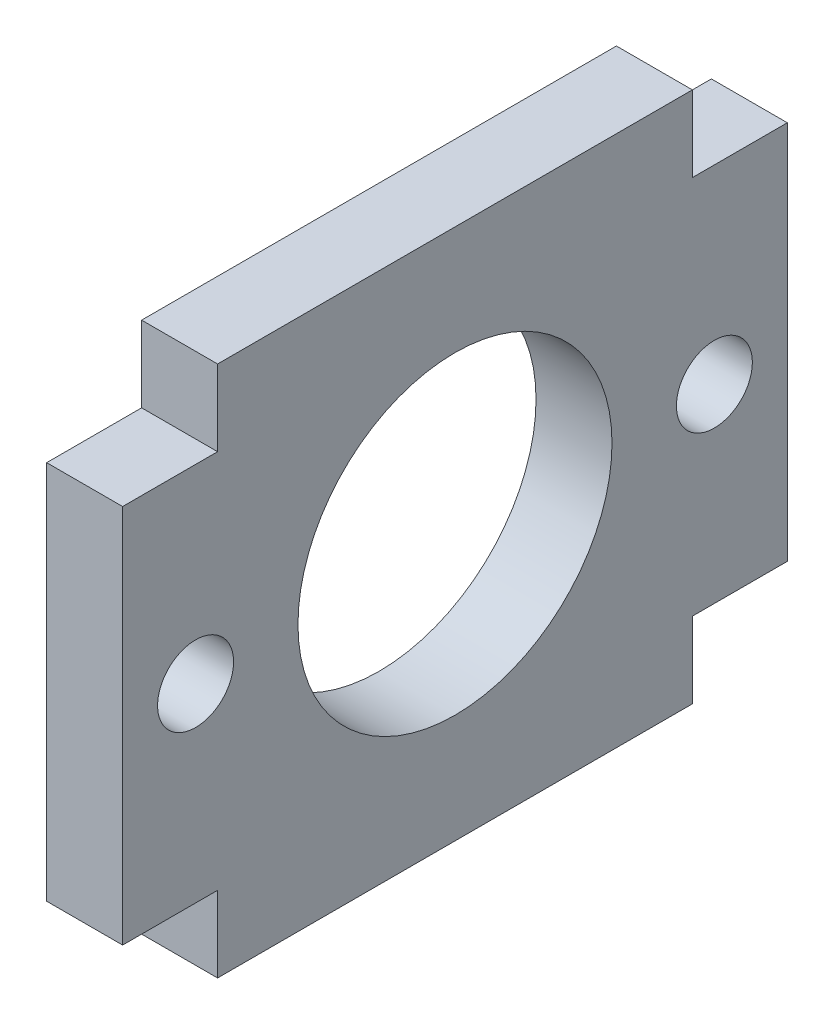
ISO-10303-21;
HEADER;
FILE_DESCRIPTION(('STEP AP214'),'2;1');
FILE_NAME('part.step','',(''),(''),'','','');
FILE_SCHEMA(('AUTOMOTIVE_DESIGN { 1 0 10303 214 1 1 1 1 }'));
ENDSEC;
DATA;
#1=APPLICATION_CONTEXT('core data for automotive mechanical design processes');
#2=APPLICATION_PROTOCOL_DEFINITION('international standard','automotive_design',2000,#1);
#3=PRODUCT_CONTEXT('',#1,'mechanical');
#4=PRODUCT('Part','Part','',(#3));
#5=PRODUCT_RELATED_PRODUCT_CATEGORY('part','',(#4));
#6=PRODUCT_DEFINITION_FORMATION('','',#4);
#7=PRODUCT_DEFINITION_CONTEXT('part definition',#1,'design');
#8=PRODUCT_DEFINITION('design','',#6,#7);
#9=PRODUCT_DEFINITION_SHAPE('','',#8);
#10=(LENGTH_UNIT() NAMED_UNIT(*) SI_UNIT(.MILLI.,.METRE.));
#11=(NAMED_UNIT(*) PLANE_ANGLE_UNIT() SI_UNIT($,.RADIAN.));
#12=(NAMED_UNIT(*) SI_UNIT($,.STERADIAN.) SOLID_ANGLE_UNIT());
#13=UNCERTAINTY_MEASURE_WITH_UNIT(LENGTH_MEASURE(1.E-05),#10,'distance_accuracy_value','');
#14=(GEOMETRIC_REPRESENTATION_CONTEXT(3) GLOBAL_UNCERTAINTY_ASSIGNED_CONTEXT((#13)) GLOBAL_UNIT_ASSIGNED_CONTEXT((#10,
#11,#12)) REPRESENTATION_CONTEXT('',''));
#15=CARTESIAN_POINT('',(0.,0.,0.));
#16=DIRECTION('',(0.,0.,1.));
#17=DIRECTION('',(1.,0.,0.));
#18=AXIS2_PLACEMENT_3D('',#15,#16,#17);
#19=CARTESIAN_POINT('',(5.08,0.,-15.875));
#20=DIRECTION('',(0.,0.,-1.));
#21=DIRECTION('',(0.,1.,0.));
#22=AXIS2_PLACEMENT_3D('',#19,#20,#21);
#23=PLANE('',#22);
#24=DIRECTION('',(0.,-1.,0.));
#25=VECTOR('',#24,1.);
#26=CARTESIAN_POINT('',(0.,0.,-15.875));
#27=LINE('',#26,#25);
#28=CARTESIAN_POINT('',(0.,-12.6999999999999,-15.875));
#29=VERTEX_POINT('',#28);
#30=CARTESIAN_POINT('',(0.,-17.7799999999999,-15.875));
#31=VERTEX_POINT('',#30);
#32=EDGE_CURVE('E162',#29,#31,#27,.T.);
#33=ORIENTED_EDGE('',*,*,#32,.F.);
#34=DIRECTION('',(-1.,0.,0.));
#35=VECTOR('',#34,1.);
#36=CARTESIAN_POINT('',(5.08,-12.6999999999999,-15.875));
#37=LINE('',#36,#35);
#38=CARTESIAN_POINT('',(5.08,-12.6999999999999,-15.875));
#39=VERTEX_POINT('',#38);
#40=EDGE_CURVE('E11',#39,#29,#37,.T.);
#41=ORIENTED_EDGE('',*,*,#40,.F.);
#42=DIRECTION('',(0.,-1.,0.));
#43=VECTOR('',#42,1.);
#44=CARTESIAN_POINT('',(5.08,0.,-15.875));
#45=LINE('',#44,#43);
#46=CARTESIAN_POINT('',(5.08,-17.7799999999999,-15.875));
#47=VERTEX_POINT('',#46);
#48=EDGE_CURVE('E201',#39,#47,#45,.T.);
#49=ORIENTED_EDGE('',*,*,#48,.T.);
#50=DIRECTION('',(-1.,0.,0.));
#51=VECTOR('',#50,1.);
#52=CARTESIAN_POINT('',(5.08,-17.7799999999999,-15.875));
#53=LINE('',#52,#51);
#54=EDGE_CURVE('E98',#47,#31,#53,.T.);
#55=ORIENTED_EDGE('',*,*,#54,.T.);
#56=EDGE_LOOP('',(#33,#41,#49,#55));
#57=FACE_BOUND('',#56,.T.);
#58=ADVANCED_FACE('F35',(#57),#23,.T.);
#59=CARTESIAN_POINT('',(5.08,-12.6999999999998,1.11022302462514E-13));
#60=DIRECTION('',(0.,1.,0.));
#61=DIRECTION('',(0.,0.,1.));
#62=AXIS2_PLACEMENT_3D('',#59,#60,#61);
#63=PLANE('',#62);
#64=DIRECTION('',(0.,0.,-1.));
#65=VECTOR('',#64,1.);
#66=CARTESIAN_POINT('',(0.,-12.6999999999998,1.11022302462514E-13));
#67=LINE('',#66,#65);
#68=CARTESIAN_POINT('',(0.,-12.7,-22.225));
#69=VERTEX_POINT('',#68);
#70=EDGE_CURVE('E165',#29,#69,#67,.T.);
#71=ORIENTED_EDGE('',*,*,#70,.T.);
#72=DIRECTION('',(-1.,0.,0.));
#73=VECTOR('',#72,1.);
#74=CARTESIAN_POINT('',(5.08,-12.7,-22.225));
#75=LINE('',#74,#73);
#76=CARTESIAN_POINT('',(5.08,-12.7,-22.225));
#77=VERTEX_POINT('',#76);
#78=EDGE_CURVE('E43',#77,#69,#75,.T.);
#79=ORIENTED_EDGE('',*,*,#78,.F.);
#80=DIRECTION('',(0.,0.,-1.));
#81=VECTOR('',#80,1.);
#82=CARTESIAN_POINT('',(5.08,-12.6999999999998,1.11022302462514E-13));
#83=LINE('',#82,#81);
#84=EDGE_CURVE('E241',#39,#77,#83,.T.);
#85=ORIENTED_EDGE('',*,*,#84,.F.);
#86=ORIENTED_EDGE('',*,*,#40,.T.);
#87=EDGE_LOOP('',(#71,#79,#85,#86));
#88=FACE_BOUND('',#87,.T.);
#89=ADVANCED_FACE('F260',(#88),#63,.F.);
#90=CARTESIAN_POINT('',(5.08,0.,-22.225));
#91=DIRECTION('',(0.,0.,1.));
#92=DIRECTION('',(1.,0.,0.));
#93=AXIS2_PLACEMENT_3D('',#90,#91,#92);
#94=PLANE('',#93);
#95=DIRECTION('',(0.,1.,0.));
#96=VECTOR('',#95,1.);
#97=CARTESIAN_POINT('',(0.,0.,-22.225));
#98=LINE('',#97,#96);
#99=CARTESIAN_POINT('',(0.,12.7,-22.225));
#100=VERTEX_POINT('',#99);
#101=EDGE_CURVE('E167',#69,#100,#98,.T.);
#102=ORIENTED_EDGE('',*,*,#101,.T.);
#103=DIRECTION('',(-1.,0.,0.));
#104=VECTOR('',#103,1.);
#105=CARTESIAN_POINT('',(5.08,12.7,-22.225));
#106=LINE('',#105,#104);
#107=CARTESIAN_POINT('',(5.08,12.7,-22.225));
#108=VERTEX_POINT('',#107);
#109=EDGE_CURVE('E215',#108,#100,#106,.T.);
#110=ORIENTED_EDGE('',*,*,#109,.F.);
#111=DIRECTION('',(0.,1.,0.));
#112=VECTOR('',#111,1.);
#113=CARTESIAN_POINT('',(5.08,0.,-22.225));
#114=LINE('',#113,#112);
#115=EDGE_CURVE('E223',#77,#108,#114,.T.);
#116=ORIENTED_EDGE('',*,*,#115,.F.);
#117=ORIENTED_EDGE('',*,*,#78,.T.);
#118=EDGE_LOOP('',(#102,#110,#116,#117));
#119=FACE_BOUND('',#118,.T.);
#120=ADVANCED_FACE('F221',(#119),#94,.F.);
#121=CARTESIAN_POINT('',(5.08,12.7,0.));
#122=DIRECTION('',(0.,1.,0.));
#123=DIRECTION('',(0.,0.,1.));
#124=AXIS2_PLACEMENT_3D('',#121,#122,#123);
#125=PLANE('',#124);
#126=DIRECTION('',(0.,0.,-1.));
#127=VECTOR('',#126,1.);
#128=CARTESIAN_POINT('',(0.,12.7,0.));
#129=LINE('',#128,#127);
#130=CARTESIAN_POINT('',(0.,12.7,-15.875));
#131=VERTEX_POINT('',#130);
#132=EDGE_CURVE('E170',#131,#100,#129,.T.);
#133=ORIENTED_EDGE('',*,*,#132,.F.);
#134=DIRECTION('',(-1.,0.,0.));
#135=VECTOR('',#134,1.);
#136=CARTESIAN_POINT('',(5.08,12.7,-15.875));
#137=LINE('',#136,#135);
#138=CARTESIAN_POINT('',(5.08,12.7,-15.875));
#139=VERTEX_POINT('',#138);
#140=EDGE_CURVE('E213',#139,#131,#137,.T.);
#141=ORIENTED_EDGE('',*,*,#140,.F.);
#142=DIRECTION('',(0.,0.,-1.));
#143=VECTOR('',#142,1.);
#144=CARTESIAN_POINT('',(5.08,12.7,0.));
#145=LINE('',#144,#143);
#146=EDGE_CURVE('E236',#139,#108,#145,.T.);
#147=ORIENTED_EDGE('',*,*,#146,.T.);
#148=ORIENTED_EDGE('',*,*,#109,.T.);
#149=EDGE_LOOP('',(#133,#141,#147,#148));
#150=FACE_BOUND('',#149,.T.);
#151=ADVANCED_FACE('F232',(#150),#125,.T.);
#152=CARTESIAN_POINT('',(5.08,0.,-15.875));
#153=DIRECTION('',(0.,0.,1.));
#154=DIRECTION('',(1.,0.,0.));
#155=AXIS2_PLACEMENT_3D('',#152,#153,#154);
#156=PLANE('',#155);
#157=DIRECTION('',(0.,1.,0.));
#158=VECTOR('',#157,1.);
#159=CARTESIAN_POINT('',(0.,0.,-15.875));
#160=LINE('',#159,#158);
#161=CARTESIAN_POINT('',(0.,17.78,-15.875));
#162=VERTEX_POINT('',#161);
#163=EDGE_CURVE('E173',#131,#162,#160,.T.);
#164=ORIENTED_EDGE('',*,*,#163,.T.);
#165=DIRECTION('',(-1.,0.,0.));
#166=VECTOR('',#165,1.);
#167=CARTESIAN_POINT('',(5.08,17.78,-15.875));
#168=LINE('',#167,#166);
#169=CARTESIAN_POINT('',(5.08,17.78,-15.875));
#170=VERTEX_POINT('',#169);
#171=EDGE_CURVE('E211',#170,#162,#168,.T.);
#172=ORIENTED_EDGE('',*,*,#171,.F.);
#173=DIRECTION('',(0.,1.,0.));
#174=VECTOR('',#173,1.);
#175=CARTESIAN_POINT('',(5.08,0.,-15.875));
#176=LINE('',#175,#174);
#177=EDGE_CURVE('E237',#139,#170,#176,.T.);
#178=ORIENTED_EDGE('',*,*,#177,.F.);
#179=ORIENTED_EDGE('',*,*,#140,.T.);
#180=EDGE_LOOP('',(#164,#172,#178,#179));
#181=FACE_BOUND('',#180,.T.);
#182=ADVANCED_FACE('F270',(#181),#156,.F.);
#183=CARTESIAN_POINT('',(5.08,17.78,0.));
#184=DIRECTION('',(0.,1.,0.));
#185=DIRECTION('',(0.,0.,1.));
#186=AXIS2_PLACEMENT_3D('',#183,#184,#185);
#187=PLANE('',#186);
#188=DIRECTION('',(0.,0.,-1.));
#189=VECTOR('',#188,1.);
#190=CARTESIAN_POINT('',(0.,17.78,0.));
#191=LINE('',#190,#189);
#192=CARTESIAN_POINT('',(0.,17.78,15.875));
#193=VERTEX_POINT('',#192);
#194=EDGE_CURVE('E176',#193,#162,#191,.T.);
#195=ORIENTED_EDGE('',*,*,#194,.F.);
#196=DIRECTION('',(-1.,0.,0.));
#197=VECTOR('',#196,1.);
#198=CARTESIAN_POINT('',(5.08,17.78,15.875));
#199=LINE('',#198,#197);
#200=CARTESIAN_POINT('',(5.08,17.78,15.875));
#201=VERTEX_POINT('',#200);
#202=EDGE_CURVE('E209',#201,#193,#199,.T.);
#203=ORIENTED_EDGE('',*,*,#202,.F.);
#204=DIRECTION('',(0.,0.,-1.));
#205=VECTOR('',#204,1.);
#206=CARTESIAN_POINT('',(5.08,17.78,0.));
#207=LINE('',#206,#205);
#208=EDGE_CURVE('E239',#201,#170,#207,.T.);
#209=ORIENTED_EDGE('',*,*,#208,.T.);
#210=ORIENTED_EDGE('',*,*,#171,.T.);
#211=EDGE_LOOP('',(#195,#203,#209,#210));
#212=FACE_BOUND('',#211,.T.);
#213=ADVANCED_FACE('F273',(#212),#187,.T.);
#214=CARTESIAN_POINT('',(5.08,0.,15.875));
#215=DIRECTION('',(0.,0.,1.));
#216=DIRECTION('',(1.,0.,0.));
#217=AXIS2_PLACEMENT_3D('',#214,#215,#216);
#218=PLANE('',#217);
#219=DIRECTION('',(0.,1.,0.));
#220=VECTOR('',#219,1.);
#221=CARTESIAN_POINT('',(0.,0.,15.875));
#222=LINE('',#221,#220);
#223=CARTESIAN_POINT('',(0.,12.7,15.875));
#224=VERTEX_POINT('',#223);
#225=EDGE_CURVE('E179',#224,#193,#222,.T.);
#226=ORIENTED_EDGE('',*,*,#225,.F.);
#227=DIRECTION('',(-1.,0.,0.));
#228=VECTOR('',#227,1.);
#229=CARTESIAN_POINT('',(5.08,12.7,15.875));
#230=LINE('',#229,#228);
#231=CARTESIAN_POINT('',(5.08,12.7,15.875));
#232=VERTEX_POINT('',#231);
#233=EDGE_CURVE('E207',#232,#224,#230,.T.);
#234=ORIENTED_EDGE('',*,*,#233,.F.);
#235=DIRECTION('',(0.,1.,0.));
#236=VECTOR('',#235,1.);
#237=CARTESIAN_POINT('',(5.08,0.,15.875));
#238=LINE('',#237,#236);
#239=EDGE_CURVE('E247',#232,#201,#238,.T.);
#240=ORIENTED_EDGE('',*,*,#239,.T.);
#241=ORIENTED_EDGE('',*,*,#202,.T.);
#242=EDGE_LOOP('',(#226,#234,#240,#241));
#243=FACE_BOUND('',#242,.T.);
#244=ADVANCED_FACE('F277',(#243),#218,.T.);
#245=CARTESIAN_POINT('',(5.08,12.7,0.));
#246=DIRECTION('',(0.,1.,0.));
#247=DIRECTION('',(0.,0.,1.));
#248=AXIS2_PLACEMENT_3D('',#245,#246,#247);
#249=PLANE('',#248);
#250=DIRECTION('',(0.,0.,-1.));
#251=VECTOR('',#250,1.);
#252=CARTESIAN_POINT('',(0.,12.7,0.));
#253=LINE('',#252,#251);
#254=CARTESIAN_POINT('',(0.,12.7,22.225));
#255=VERTEX_POINT('',#254);
#256=EDGE_CURVE('E182',#255,#224,#253,.T.);
#257=ORIENTED_EDGE('',*,*,#256,.F.);
#258=DIRECTION('',(-1.,0.,0.));
#259=VECTOR('',#258,1.);
#260=CARTESIAN_POINT('',(5.08,12.7,22.225));
#261=LINE('',#260,#259);
#262=CARTESIAN_POINT('',(5.08,12.7,22.225));
#263=VERTEX_POINT('',#262);
#264=EDGE_CURVE('E205',#263,#255,#261,.T.);
#265=ORIENTED_EDGE('',*,*,#264,.F.);
#266=DIRECTION('',(0.,0.,-1.));
#267=VECTOR('',#266,1.);
#268=CARTESIAN_POINT('',(5.08,12.7,0.));
#269=LINE('',#268,#267);
#270=EDGE_CURVE('E250',#263,#232,#269,.T.);
#271=ORIENTED_EDGE('',*,*,#270,.T.);
#272=ORIENTED_EDGE('',*,*,#233,.T.);
#273=EDGE_LOOP('',(#257,#265,#271,#272));
#274=FACE_BOUND('',#273,.T.);
#275=ADVANCED_FACE('F281',(#274),#249,.T.);
#276=CARTESIAN_POINT('',(5.08,0.,22.225));
#277=DIRECTION('',(0.,0.,1.));
#278=DIRECTION('',(1.,0.,0.));
#279=AXIS2_PLACEMENT_3D('',#276,#277,#278);
#280=PLANE('',#279);
#281=DIRECTION('',(0.,1.,0.));
#282=VECTOR('',#281,1.);
#283=CARTESIAN_POINT('',(0.,0.,22.225));
#284=LINE('',#283,#282);
#285=CARTESIAN_POINT('',(0.,-12.7,22.225));
#286=VERTEX_POINT('',#285);
#287=EDGE_CURVE('E185',#286,#255,#284,.T.);
#288=ORIENTED_EDGE('',*,*,#287,.F.);
#289=DIRECTION('',(-1.,0.,0.));
#290=VECTOR('',#289,1.);
#291=CARTESIAN_POINT('',(5.08,-12.7,22.225));
#292=LINE('',#291,#290);
#293=CARTESIAN_POINT('',(5.08,-12.7,22.225));
#294=VERTEX_POINT('',#293);
#295=EDGE_CURVE('E145',#294,#286,#292,.T.);
#296=ORIENTED_EDGE('',*,*,#295,.F.);
#297=DIRECTION('',(0.,1.,0.));
#298=VECTOR('',#297,1.);
#299=CARTESIAN_POINT('',(5.08,0.,22.225));
#300=LINE('',#299,#298);
#301=EDGE_CURVE('E138',#294,#263,#300,.T.);
#302=ORIENTED_EDGE('',*,*,#301,.T.);
#303=ORIENTED_EDGE('',*,*,#264,.T.);
#304=EDGE_LOOP('',(#288,#296,#302,#303));
#305=FACE_BOUND('',#304,.T.);
#306=ADVANCED_FACE('F254',(#305),#280,.T.);
#307=CARTESIAN_POINT('',(5.08,-12.7,0.));
#308=DIRECTION('',(0.,1.,0.));
#309=DIRECTION('',(0.,0.,1.));
#310=AXIS2_PLACEMENT_3D('',#307,#308,#309);
#311=PLANE('',#310);
#312=DIRECTION('',(0.,0.,-1.));
#313=VECTOR('',#312,1.);
#314=CARTESIAN_POINT('',(0.,-12.7,0.));
#315=LINE('',#314,#313);
#316=CARTESIAN_POINT('',(0.,-12.7,15.875));
#317=VERTEX_POINT('',#316);
#318=EDGE_CURVE('E144',#286,#317,#315,.T.);
#319=ORIENTED_EDGE('',*,*,#318,.T.);
#320=DIRECTION('',(-1.,0.,0.));
#321=VECTOR('',#320,1.);
#322=CARTESIAN_POINT('',(5.08,-12.7,15.875));
#323=LINE('',#322,#321);
#324=CARTESIAN_POINT('',(5.08,-12.7,15.875));
#325=VERTEX_POINT('',#324);
#326=EDGE_CURVE('E141',#325,#317,#323,.T.);
#327=ORIENTED_EDGE('',*,*,#326,.F.);
#328=DIRECTION('',(0.,0.,-1.));
#329=VECTOR('',#328,1.);
#330=CARTESIAN_POINT('',(5.08,-12.7,0.));
#331=LINE('',#330,#329);
#332=EDGE_CURVE('E130',#294,#325,#331,.T.);
#333=ORIENTED_EDGE('',*,*,#332,.F.);
#334=ORIENTED_EDGE('',*,*,#295,.T.);
#335=EDGE_LOOP('',(#319,#327,#333,#334));
#336=FACE_BOUND('',#335,.T.);
#337=ADVANCED_FACE('F142',(#336),#311,.F.);
#338=CARTESIAN_POINT('',(5.08,0.,15.875));
#339=DIRECTION('',(0.,0.,-1.));
#340=DIRECTION('',(0.,1.,0.));
#341=AXIS2_PLACEMENT_3D('',#338,#339,#340);
#342=PLANE('',#341);
#343=DIRECTION('',(0.,-1.,0.));
#344=VECTOR('',#343,1.);
#345=CARTESIAN_POINT('',(0.,0.,15.875));
#346=LINE('',#345,#344);
#347=CARTESIAN_POINT('',(0.,-17.78,15.875));
#348=VERTEX_POINT('',#347);
#349=EDGE_CURVE('E91',#317,#348,#346,.T.);
#350=ORIENTED_EDGE('',*,*,#349,.T.);
#351=DIRECTION('',(-1.,0.,0.));
#352=VECTOR('',#351,1.);
#353=CARTESIAN_POINT('',(5.08,-17.78,15.875));
#354=LINE('',#353,#352);
#355=CARTESIAN_POINT('',(5.08,-17.78,15.875));
#356=VERTEX_POINT('',#355);
#357=EDGE_CURVE('E146',#356,#348,#354,.T.);
#358=ORIENTED_EDGE('',*,*,#357,.F.);
#359=DIRECTION('',(0.,-1.,0.));
#360=VECTOR('',#359,1.);
#361=CARTESIAN_POINT('',(5.08,0.,15.875));
#362=LINE('',#361,#360);
#363=EDGE_CURVE('E135',#325,#356,#362,.T.);
#364=ORIENTED_EDGE('',*,*,#363,.F.);
#365=ORIENTED_EDGE('',*,*,#326,.T.);
#366=EDGE_LOOP('',(#350,#358,#364,#365));
#367=FACE_BOUND('',#366,.T.);
#368=ADVANCED_FACE('F148',(#367),#342,.F.);
#369=CARTESIAN_POINT('',(5.08,0.,17.3462810913037));
#370=DIRECTION('',(-1.,0.,0.));
#371=DIRECTION('',(0.,0.,1.));
#372=AXIS2_PLACEMENT_3D('',#369,#370,#371);
#373=CYLINDRICAL_SURFACE('',#372,2.54);
#374=CARTESIAN_POINT('',(5.08,0.,17.3462810913037));
#375=DIRECTION('',(1.,0.,0.));
#376=DIRECTION('',(0.,0.,-1.));
#377=AXIS2_PLACEMENT_3D('',#374,#375,#376);
#378=CIRCLE('',#377,2.54);
#379=CARTESIAN_POINT('',(5.08,0.,14.8062810913037));
#380=VERTEX_POINT('',#379);
#381=EDGE_CURVE('E156',#380,#380,#378,.T.);
#382=ORIENTED_EDGE('',*,*,#381,.T.);
#383=EDGE_LOOP('',(#382));
#384=FACE_BOUND('',#383,.T.);
#385=CARTESIAN_POINT('',(0.,0.,17.3462810913037));
#386=DIRECTION('',(1.,0.,0.));
#387=DIRECTION('',(0.,0.,-1.));
#388=AXIS2_PLACEMENT_3D('',#385,#386,#387);
#389=CIRCLE('',#388,2.54);
#390=CARTESIAN_POINT('',(0.,0.,14.8062810913037));
#391=VERTEX_POINT('',#390);
#392=EDGE_CURVE('E195',#391,#391,#389,.T.);
#393=ORIENTED_EDGE('',*,*,#392,.F.);
#394=EDGE_LOOP('',(#393));
#395=FACE_BOUND('',#394,.T.);
#396=ADVANCED_FACE('F292',(#384,#395),#373,.F.);
#397=CARTESIAN_POINT('',(5.08,0.,0.));
#398=DIRECTION('',(-1.,0.,0.));
#399=DIRECTION('',(0.,0.,1.));
#400=AXIS2_PLACEMENT_3D('',#397,#398,#399);
#401=CYLINDRICAL_SURFACE('',#400,10.499999955);
#402=CARTESIAN_POINT('',(5.08,0.,0.));
#403=DIRECTION('',(1.,0.,0.));
#404=DIRECTION('',(0.,0.,-1.));
#405=AXIS2_PLACEMENT_3D('',#402,#403,#404);
#406=CIRCLE('',#405,10.499999955);
#407=CARTESIAN_POINT('',(5.08,0.,-10.499999955));
#408=VERTEX_POINT('',#407);
#409=EDGE_CURVE('E150',#408,#408,#406,.T.);
#410=ORIENTED_EDGE('',*,*,#409,.T.);
#411=EDGE_LOOP('',(#410));
#412=FACE_BOUND('',#411,.T.);
#413=CARTESIAN_POINT('',(0.,0.,0.));
#414=DIRECTION('',(1.,0.,0.));
#415=DIRECTION('',(0.,0.,-1.));
#416=AXIS2_PLACEMENT_3D('',#413,#414,#415);
#417=CIRCLE('',#416,10.499999955);
#418=CARTESIAN_POINT('',(0.,0.,-10.499999955));
#419=VERTEX_POINT('',#418);
#420=EDGE_CURVE('E192',#419,#419,#417,.T.);
#421=ORIENTED_EDGE('',*,*,#420,.F.);
#422=EDGE_LOOP('',(#421));
#423=FACE_BOUND('',#422,.T.);
#424=ADVANCED_FACE('F296',(#412,#423),#401,.F.);
#425=CARTESIAN_POINT('',(5.08,-17.78,0.));
#426=DIRECTION('',(0.,1.,0.));
#427=DIRECTION('',(0.,0.,1.));
#428=AXIS2_PLACEMENT_3D('',#425,#426,#427);
#429=PLANE('',#428);
#430=DIRECTION('',(0.,0.,-1.));
#431=VECTOR('',#430,1.);
#432=CARTESIAN_POINT('',(0.,-17.78,0.));
#433=LINE('',#432,#431);
#434=EDGE_CURVE('E190',#348,#31,#433,.T.);
#435=ORIENTED_EDGE('',*,*,#434,.T.);
#436=ORIENTED_EDGE('',*,*,#54,.F.);
#437=DIRECTION('',(0.,0.,-1.));
#438=VECTOR('',#437,1.);
#439=CARTESIAN_POINT('',(5.08,-17.78,0.));
#440=LINE('',#439,#438);
#441=EDGE_CURVE('E51',#356,#47,#440,.T.);
#442=ORIENTED_EDGE('',*,*,#441,.F.);
#443=ORIENTED_EDGE('',*,*,#357,.T.);
#444=EDGE_LOOP('',(#435,#436,#442,#443));
#445=FACE_BOUND('',#444,.T.);
#446=ADVANCED_FACE('F258',(#445),#429,.F.);
#447=CARTESIAN_POINT('',(5.08,-1.52655665885959E-13,-17.3462810913035));
#448=DIRECTION('',(-1.,0.,0.));
#449=DIRECTION('',(0.,0.,1.));
#450=AXIS2_PLACEMENT_3D('',#447,#448,#449);
#451=CYLINDRICAL_SURFACE('',#450,2.54);
#452=CARTESIAN_POINT('',(5.08,-1.52655665885959E-13,-17.3462810913035));
#453=DIRECTION('',(1.,0.,0.));
#454=DIRECTION('',(0.,0.,-1.));
#455=AXIS2_PLACEMENT_3D('',#452,#453,#454);
#456=CIRCLE('',#455,2.54);
#457=CARTESIAN_POINT('',(5.08,-1.52655665885959E-13,-19.8862810913035));
#458=VERTEX_POINT('',#457);
#459=EDGE_CURVE('E159',#458,#458,#456,.F.);
#460=ORIENTED_EDGE('',*,*,#459,.F.);
#461=EDGE_LOOP('',(#460));
#462=FACE_BOUND('',#461,.T.);
#463=CARTESIAN_POINT('',(0.,-1.52655665885959E-13,-17.3462810913035));
#464=DIRECTION('',(1.,0.,0.));
#465=DIRECTION('',(0.,0.,-1.));
#466=AXIS2_PLACEMENT_3D('',#463,#464,#465);
#467=CIRCLE('',#466,2.54);
#468=CARTESIAN_POINT('',(0.,-1.52655665885959E-13,-19.8862810913035));
#469=VERTEX_POINT('',#468);
#470=EDGE_CURVE('E198',#469,#469,#467,.F.);
#471=ORIENTED_EDGE('',*,*,#470,.T.);
#472=EDGE_LOOP('',(#471));
#473=FACE_BOUND('',#472,.T.);
#474=ADVANCED_FACE('F295',(#462,#473),#451,.F.);
#475=CARTESIAN_POINT('',(5.08,0.,0.));
#476=DIRECTION('',(1.,0.,0.));
#477=DIRECTION('',(0.,0.,-1.));
#478=AXIS2_PLACEMENT_3D('',#475,#476,#477);
#479=PLANE('',#478);
#480=ORIENTED_EDGE('',*,*,#48,.F.);
#481=ORIENTED_EDGE('',*,*,#84,.T.);
#482=ORIENTED_EDGE('',*,*,#115,.T.);
#483=ORIENTED_EDGE('',*,*,#146,.F.);
#484=ORIENTED_EDGE('',*,*,#177,.T.);
#485=ORIENTED_EDGE('',*,*,#208,.F.);
#486=ORIENTED_EDGE('',*,*,#239,.F.);
#487=ORIENTED_EDGE('',*,*,#270,.F.);
#488=ORIENTED_EDGE('',*,*,#301,.F.);
#489=ORIENTED_EDGE('',*,*,#332,.T.);
#490=ORIENTED_EDGE('',*,*,#363,.T.);
#491=ORIENTED_EDGE('',*,*,#441,.T.);
#492=EDGE_LOOP('',(#480,#481,#482,#483,#484,#485,#486,#487,#488,#489,#490,#491));
#493=FACE_BOUND('',#492,.T.);
#494=ORIENTED_EDGE('',*,*,#409,.F.);
#495=EDGE_LOOP('',(#494));
#496=FACE_BOUND('',#495,.T.);
#497=ORIENTED_EDGE('',*,*,#381,.F.);
#498=EDGE_LOOP('',(#497));
#499=FACE_BOUND('',#498,.T.);
#500=ORIENTED_EDGE('',*,*,#459,.T.);
#501=EDGE_LOOP('',(#500));
#502=FACE_BOUND('',#501,.T.);
#503=ADVANCED_FACE('F132',(#493,#496,#499,#502),#479,.T.);
#504=CARTESIAN_POINT('',(0.,0.,0.));
#505=DIRECTION('',(1.,0.,0.));
#506=DIRECTION('',(0.,0.,-1.));
#507=AXIS2_PLACEMENT_3D('',#504,#505,#506);
#508=PLANE('',#507);
#509=ORIENTED_EDGE('',*,*,#32,.T.);
#510=ORIENTED_EDGE('',*,*,#434,.F.);
#511=ORIENTED_EDGE('',*,*,#349,.F.);
#512=ORIENTED_EDGE('',*,*,#318,.F.);
#513=ORIENTED_EDGE('',*,*,#287,.T.);
#514=ORIENTED_EDGE('',*,*,#256,.T.);
#515=ORIENTED_EDGE('',*,*,#225,.T.);
#516=ORIENTED_EDGE('',*,*,#194,.T.);
#517=ORIENTED_EDGE('',*,*,#163,.F.);
#518=ORIENTED_EDGE('',*,*,#132,.T.);
#519=ORIENTED_EDGE('',*,*,#101,.F.);
#520=ORIENTED_EDGE('',*,*,#70,.F.);
#521=EDGE_LOOP('',(#509,#510,#511,#512,#513,#514,#515,#516,#517,#518,#519,#520));
#522=FACE_BOUND('',#521,.T.);
#523=ORIENTED_EDGE('',*,*,#420,.T.);
#524=EDGE_LOOP('',(#523));
#525=FACE_BOUND('',#524,.T.);
#526=ORIENTED_EDGE('',*,*,#392,.T.);
#527=EDGE_LOOP('',(#526));
#528=FACE_BOUND('',#527,.T.);
#529=ORIENTED_EDGE('',*,*,#470,.F.);
#530=EDGE_LOOP('',(#529));
#531=FACE_BOUND('',#530,.T.);
#532=ADVANCED_FACE('F227',(#522,#525,#528,#531),#508,.F.);
#533=CLOSED_SHELL('',(#58,#89,#120,#151,#182,#213,#244,#275,#306,#337,#368,#396,#424,#446,#474,
#503,#532));
#534=MANIFOLD_SOLID_BREP('B2',#533);
#535=ADVANCED_BREP_SHAPE_REPRESENTATION('',(#18,#534),#14);
#536=SHAPE_DEFINITION_REPRESENTATION(#9,#535);
ENDSEC;
END-ISO-10303-21;
